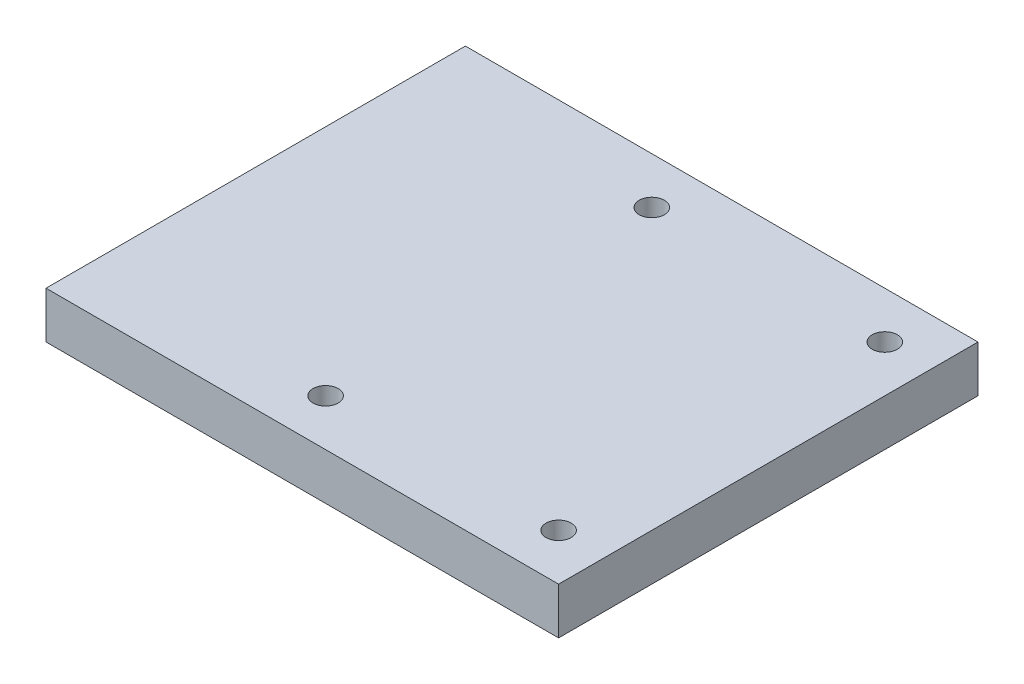
ISO-10303-21;
HEADER;
FILE_DESCRIPTION(('STEP AP214'),'2;1');
FILE_NAME('part.step','',(''),(''),'','','');
FILE_SCHEMA(('AUTOMOTIVE_DESIGN { 1 0 10303 214 1 1 1 1 }'));
ENDSEC;
DATA;
#1=APPLICATION_CONTEXT('core data for automotive mechanical design processes');
#2=APPLICATION_PROTOCOL_DEFINITION('international standard','automotive_design',2000,#1);
#3=PRODUCT_CONTEXT('',#1,'mechanical');
#4=PRODUCT('Part','Part','',(#3));
#5=PRODUCT_RELATED_PRODUCT_CATEGORY('part','',(#4));
#6=PRODUCT_DEFINITION_FORMATION('','',#4);
#7=PRODUCT_DEFINITION_CONTEXT('part definition',#1,'design');
#8=PRODUCT_DEFINITION('design','',#6,#7);
#9=PRODUCT_DEFINITION_SHAPE('','',#8);
#10=(LENGTH_UNIT() NAMED_UNIT(*) SI_UNIT(.MILLI.,.METRE.));
#11=(NAMED_UNIT(*) PLANE_ANGLE_UNIT() SI_UNIT($,.RADIAN.));
#12=(NAMED_UNIT(*) SI_UNIT($,.STERADIAN.) SOLID_ANGLE_UNIT());
#13=UNCERTAINTY_MEASURE_WITH_UNIT(LENGTH_MEASURE(1.E-05),#10,'distance_accuracy_value','');
#14=(GEOMETRIC_REPRESENTATION_CONTEXT(3) GLOBAL_UNCERTAINTY_ASSIGNED_CONTEXT((#13)) GLOBAL_UNIT_ASSIGNED_CONTEXT((#10,
#11,#12)) REPRESENTATION_CONTEXT('',''));
#15=CARTESIAN_POINT('',(0.,0.,0.));
#16=DIRECTION('',(0.,0.,1.));
#17=DIRECTION('',(1.,0.,0.));
#18=AXIS2_PLACEMENT_3D('',#15,#16,#17);
#19=CARTESIAN_POINT('',(69.85,12.7,-57.15));
#20=DIRECTION('',(-1.,0.,0.));
#21=DIRECTION('',(0.,0.,1.));
#22=AXIS2_PLACEMENT_3D('',#19,#20,#21);
#23=PLANE('',#22);
#24=DIRECTION('',(0.,0.,-1.));
#25=VECTOR('',#24,1.);
#26=CARTESIAN_POINT('',(69.85,0.,-57.15));
#27=LINE('',#26,#25);
#28=CARTESIAN_POINT('',(69.85,0.,57.15));
#29=VERTEX_POINT('',#28);
#30=CARTESIAN_POINT('',(69.85,0.,-57.15));
#31=VERTEX_POINT('',#30);
#32=EDGE_CURVE('E96',#29,#31,#27,.T.);
#33=ORIENTED_EDGE('',*,*,#32,.T.);
#34=DIRECTION('',(0.,-1.,0.));
#35=VECTOR('',#34,1.);
#36=CARTESIAN_POINT('',(69.85,12.7,-57.15));
#37=LINE('',#36,#35);
#38=CARTESIAN_POINT('',(69.85,12.7,-57.15));
#39=VERTEX_POINT('',#38);
#40=EDGE_CURVE('E11',#39,#31,#37,.T.);
#41=ORIENTED_EDGE('',*,*,#40,.F.);
#42=DIRECTION('',(0.,0.,-1.));
#43=VECTOR('',#42,1.);
#44=CARTESIAN_POINT('',(69.85,12.7,-57.15));
#45=LINE('',#44,#43);
#46=CARTESIAN_POINT('',(69.85,12.7,57.15));
#47=VERTEX_POINT('',#46);
#48=EDGE_CURVE('E84',#47,#39,#45,.T.);
#49=ORIENTED_EDGE('',*,*,#48,.F.);
#50=DIRECTION('',(0.,-1.,0.));
#51=VECTOR('',#50,1.);
#52=CARTESIAN_POINT('',(69.85,12.7,57.15));
#53=LINE('',#52,#51);
#54=EDGE_CURVE('E92',#47,#29,#53,.T.);
#55=ORIENTED_EDGE('',*,*,#54,.T.);
#56=EDGE_LOOP('',(#33,#41,#49,#55));
#57=FACE_BOUND('',#56,.T.);
#58=ADVANCED_FACE('F33',(#57),#23,.F.);
#59=CARTESIAN_POINT('',(-69.85,12.7,-57.15));
#60=DIRECTION('',(0.,0.,1.));
#61=DIRECTION('',(1.,0.,0.));
#62=AXIS2_PLACEMENT_3D('',#59,#60,#61);
#63=PLANE('',#62);
#64=DIRECTION('',(-1.,0.,0.));
#65=VECTOR('',#64,1.);
#66=CARTESIAN_POINT('',(-69.85,0.,-57.15));
#67=LINE('',#66,#65);
#68=CARTESIAN_POINT('',(-69.85,0.,-57.15));
#69=VERTEX_POINT('',#68);
#70=EDGE_CURVE('E88',#31,#69,#67,.T.);
#71=ORIENTED_EDGE('',*,*,#70,.T.);
#72=DIRECTION('',(0.,-1.,0.));
#73=VECTOR('',#72,1.);
#74=CARTESIAN_POINT('',(-69.85,12.7,-57.15));
#75=LINE('',#74,#73);
#76=CARTESIAN_POINT('',(-69.85,12.7,-57.15));
#77=VERTEX_POINT('',#76);
#78=EDGE_CURVE('E41',#77,#69,#75,.T.);
#79=ORIENTED_EDGE('',*,*,#78,.F.);
#80=DIRECTION('',(-1.,0.,0.));
#81=VECTOR('',#80,1.);
#82=CARTESIAN_POINT('',(-69.85,12.7,-57.15));
#83=LINE('',#82,#81);
#84=EDGE_CURVE('E79',#39,#77,#83,.T.);
#85=ORIENTED_EDGE('',*,*,#84,.F.);
#86=ORIENTED_EDGE('',*,*,#40,.T.);
#87=EDGE_LOOP('',(#71,#79,#85,#86));
#88=FACE_BOUND('',#87,.T.);
#89=ADVANCED_FACE('F87',(#88),#63,.F.);
#90=CARTESIAN_POINT('',(-69.85,12.7,-57.15));
#91=DIRECTION('',(1.,0.,0.));
#92=DIRECTION('',(0.,0.,-1.));
#93=AXIS2_PLACEMENT_3D('',#90,#91,#92);
#94=PLANE('',#93);
#95=DIRECTION('',(0.,0.,1.));
#96=VECTOR('',#95,1.);
#97=CARTESIAN_POINT('',(-69.85,0.,-57.15));
#98=LINE('',#97,#96);
#99=CARTESIAN_POINT('',(-69.85,0.,57.15));
#100=VERTEX_POINT('',#99);
#101=EDGE_CURVE('E66',#69,#100,#98,.T.);
#102=ORIENTED_EDGE('',*,*,#101,.T.);
#103=DIRECTION('',(0.,-1.,0.));
#104=VECTOR('',#103,1.);
#105=CARTESIAN_POINT('',(-69.85,12.7,57.15));
#106=LINE('',#105,#104);
#107=CARTESIAN_POINT('',(-69.85,12.7,57.15));
#108=VERTEX_POINT('',#107);
#109=EDGE_CURVE('E89',#108,#100,#106,.T.);
#110=ORIENTED_EDGE('',*,*,#109,.F.);
#111=DIRECTION('',(0.,0.,1.));
#112=VECTOR('',#111,1.);
#113=CARTESIAN_POINT('',(-69.85,12.7,-57.15));
#114=LINE('',#113,#112);
#115=EDGE_CURVE('E82',#77,#108,#114,.T.);
#116=ORIENTED_EDGE('',*,*,#115,.F.);
#117=ORIENTED_EDGE('',*,*,#78,.T.);
#118=EDGE_LOOP('',(#102,#110,#116,#117));
#119=FACE_BOUND('',#118,.T.);
#120=ADVANCED_FACE('F90',(#119),#94,.F.);
#121=CARTESIAN_POINT('',(-69.85,12.7,57.15));
#122=DIRECTION('',(0.,0.,-1.));
#123=DIRECTION('',(-1.,0.,0.));
#124=AXIS2_PLACEMENT_3D('',#121,#122,#123);
#125=PLANE('',#124);
#126=DIRECTION('',(1.,0.,0.));
#127=VECTOR('',#126,1.);
#128=CARTESIAN_POINT('',(-69.85,0.,57.15));
#129=LINE('',#128,#127);
#130=EDGE_CURVE('E72',#100,#29,#129,.T.);
#131=ORIENTED_EDGE('',*,*,#130,.T.);
#132=ORIENTED_EDGE('',*,*,#54,.F.);
#133=DIRECTION('',(1.,0.,0.));
#134=VECTOR('',#133,1.);
#135=CARTESIAN_POINT('',(-69.85,12.7,57.15));
#136=LINE('',#135,#134);
#137=EDGE_CURVE('E49',#108,#47,#136,.T.);
#138=ORIENTED_EDGE('',*,*,#137,.F.);
#139=ORIENTED_EDGE('',*,*,#109,.T.);
#140=EDGE_LOOP('',(#131,#132,#138,#139));
#141=FACE_BOUND('',#140,.T.);
#142=ADVANCED_FACE('F104',(#141),#125,.F.);
#143=CARTESIAN_POINT('',(0.,12.7,0.));
#144=DIRECTION('',(0.,1.,0.));
#145=DIRECTION('',(0.,0.,1.));
#146=AXIS2_PLACEMENT_3D('',#143,#144,#145);
#147=PLANE('',#146);
#148=CARTESIAN_POINT('',(57.15,12.7,-44.45));
#149=DIRECTION('',(0.,1.,0.));
#150=DIRECTION('',(0.,0.,1.));
#151=AXIS2_PLACEMENT_3D('',#148,#149,#150);
#152=CIRCLE('',#151,3.42899999999999);
#153=CARTESIAN_POINT('',(57.15,12.7,-41.021));
#154=VERTEX_POINT('',#153);
#155=EDGE_CURVE('E128',#154,#154,#152,.F.);
#156=ORIENTED_EDGE('',*,*,#155,.T.);
#157=EDGE_LOOP('',(#156));
#158=FACE_BOUND('',#157,.T.);
#159=CARTESIAN_POINT('',(57.15,12.7,44.45));
#160=DIRECTION('',(0.,1.,0.));
#161=DIRECTION('',(0.,0.,1.));
#162=AXIS2_PLACEMENT_3D('',#159,#160,#161);
#163=CIRCLE('',#162,3.42899999999999);
#164=CARTESIAN_POINT('',(57.15,12.7,47.879));
#165=VERTEX_POINT('',#164);
#166=EDGE_CURVE('E122',#165,#165,#163,.F.);
#167=ORIENTED_EDGE('',*,*,#166,.T.);
#168=EDGE_LOOP('',(#167));
#169=FACE_BOUND('',#168,.T.);
#170=CARTESIAN_POINT('',(-6.34999999999998,12.7,-44.45));
#171=DIRECTION('',(0.,1.,0.));
#172=DIRECTION('',(0.,0.,1.));
#173=AXIS2_PLACEMENT_3D('',#170,#171,#172);
#174=CIRCLE('',#173,3.429);
#175=CARTESIAN_POINT('',(-6.34999999999998,12.7,-41.021));
#176=VERTEX_POINT('',#175);
#177=EDGE_CURVE('E116',#176,#176,#174,.F.);
#178=ORIENTED_EDGE('',*,*,#177,.T.);
#179=EDGE_LOOP('',(#178));
#180=FACE_BOUND('',#179,.T.);
#181=CARTESIAN_POINT('',(-6.34999999999998,12.7,44.45));
#182=DIRECTION('',(0.,1.,0.));
#183=DIRECTION('',(0.,0.,1.));
#184=AXIS2_PLACEMENT_3D('',#181,#182,#183);
#185=CIRCLE('',#184,3.429);
#186=CARTESIAN_POINT('',(-6.34999999999998,12.7,47.879));
#187=VERTEX_POINT('',#186);
#188=EDGE_CURVE('E110',#187,#187,#185,.F.);
#189=ORIENTED_EDGE('',*,*,#188,.T.);
#190=EDGE_LOOP('',(#189));
#191=FACE_BOUND('',#190,.T.);
#192=ORIENTED_EDGE('',*,*,#48,.T.);
#193=ORIENTED_EDGE('',*,*,#84,.T.);
#194=ORIENTED_EDGE('',*,*,#115,.T.);
#195=ORIENTED_EDGE('',*,*,#137,.T.);
#196=EDGE_LOOP('',(#192,#193,#194,#195));
#197=FACE_BOUND('',#196,.T.);
#198=ADVANCED_FACE('F80',(#158,#169,#180,#191,#197),#147,.T.);
#199=CARTESIAN_POINT('',(0.,0.,0.));
#200=DIRECTION('',(0.,1.,0.));
#201=DIRECTION('',(0.,0.,1.));
#202=AXIS2_PLACEMENT_3D('',#199,#200,#201);
#203=PLANE('',#202);
#204=CARTESIAN_POINT('',(-53.975,0.,0.));
#205=DIRECTION('',(0.,-1.,0.));
#206=DIRECTION('',(0.,0.,-1.));
#207=AXIS2_PLACEMENT_3D('',#204,#205,#206);
#208=CIRCLE('',#207,12.7);
#209=CARTESIAN_POINT('',(-53.975,0.,-12.7));
#210=VERTEX_POINT('',#209);
#211=EDGE_CURVE('E134',#210,#210,#208,.T.);
#212=ORIENTED_EDGE('',*,*,#211,.F.);
#213=EDGE_LOOP('',(#212));
#214=FACE_BOUND('',#213,.T.);
#215=CARTESIAN_POINT('',(57.15,0.,-44.45));
#216=DIRECTION('',(0.,-1.,0.));
#217=DIRECTION('',(0.,0.,-1.));
#218=AXIS2_PLACEMENT_3D('',#215,#216,#217);
#219=CIRCLE('',#218,3.42899999999999);
#220=CARTESIAN_POINT('',(57.15,0.,-47.879));
#221=VERTEX_POINT('',#220);
#222=EDGE_CURVE('E125',#221,#221,#219,.T.);
#223=ORIENTED_EDGE('',*,*,#222,.F.);
#224=EDGE_LOOP('',(#223));
#225=FACE_BOUND('',#224,.T.);
#226=CARTESIAN_POINT('',(57.15,0.,44.45));
#227=DIRECTION('',(0.,-1.,0.));
#228=DIRECTION('',(0.,0.,1.));
#229=AXIS2_PLACEMENT_3D('',#226,#227,#228);
#230=CIRCLE('',#229,3.42899999999999);
#231=CARTESIAN_POINT('',(57.15,0.,47.879));
#232=VERTEX_POINT('',#231);
#233=EDGE_CURVE('E119',#232,#232,#230,.T.);
#234=ORIENTED_EDGE('',*,*,#233,.F.);
#235=EDGE_LOOP('',(#234));
#236=FACE_BOUND('',#235,.T.);
#237=CARTESIAN_POINT('',(-6.34999999999998,0.,-44.45));
#238=DIRECTION('',(0.,-1.,0.));
#239=DIRECTION('',(0.,0.,1.));
#240=AXIS2_PLACEMENT_3D('',#237,#238,#239);
#241=CIRCLE('',#240,3.429);
#242=CARTESIAN_POINT('',(-6.34999999999998,0.,-41.021));
#243=VERTEX_POINT('',#242);
#244=EDGE_CURVE('E113',#243,#243,#241,.T.);
#245=ORIENTED_EDGE('',*,*,#244,.F.);
#246=EDGE_LOOP('',(#245));
#247=FACE_BOUND('',#246,.T.);
#248=CARTESIAN_POINT('',(-6.34999999999998,0.,44.45));
#249=DIRECTION('',(0.,-1.,0.));
#250=DIRECTION('',(0.,0.,-1.));
#251=AXIS2_PLACEMENT_3D('',#248,#249,#250);
#252=CIRCLE('',#251,3.429);
#253=CARTESIAN_POINT('',(-6.34999999999998,0.,41.021));
#254=VERTEX_POINT('',#253);
#255=EDGE_CURVE('E99',#254,#254,#252,.T.);
#256=ORIENTED_EDGE('',*,*,#255,.F.);
#257=EDGE_LOOP('',(#256));
#258=FACE_BOUND('',#257,.T.);
#259=ORIENTED_EDGE('',*,*,#32,.F.);
#260=ORIENTED_EDGE('',*,*,#130,.F.);
#261=ORIENTED_EDGE('',*,*,#101,.F.);
#262=ORIENTED_EDGE('',*,*,#70,.F.);
#263=EDGE_LOOP('',(#259,#260,#261,#262));
#264=FACE_BOUND('',#263,.T.);
#265=ADVANCED_FACE('F107',(#214,#225,#236,#247,#258,#264),#203,.F.);
#266=CARTESIAN_POINT('',(-6.34999999999998,12.701,44.45));
#267=DIRECTION('',(0.,-1.,0.));
#268=DIRECTION('',(0.,0.,-1.));
#269=AXIS2_PLACEMENT_3D('',#266,#267,#268);
#270=CYLINDRICAL_SURFACE('',#269,3.429);
#271=ORIENTED_EDGE('',*,*,#188,.F.);
#272=EDGE_LOOP('',(#271));
#273=FACE_BOUND('',#272,.T.);
#274=ORIENTED_EDGE('',*,*,#255,.T.);
#275=EDGE_LOOP('',(#274));
#276=FACE_BOUND('',#275,.T.);
#277=ADVANCED_FACE('F151',(#273,#276),#270,.F.);
#278=CARTESIAN_POINT('',(-6.34999999999998,12.701,-44.45));
#279=DIRECTION('',(0.,-1.,0.));
#280=DIRECTION('',(0.,0.,-1.));
#281=AXIS2_PLACEMENT_3D('',#278,#279,#280);
#282=CYLINDRICAL_SURFACE('',#281,3.429);
#283=ORIENTED_EDGE('',*,*,#177,.F.);
#284=EDGE_LOOP('',(#283));
#285=FACE_BOUND('',#284,.T.);
#286=ORIENTED_EDGE('',*,*,#244,.T.);
#287=EDGE_LOOP('',(#286));
#288=FACE_BOUND('',#287,.T.);
#289=ADVANCED_FACE('F162',(#285,#288),#282,.F.);
#290=CARTESIAN_POINT('',(57.15,12.701,44.45));
#291=DIRECTION('',(0.,-1.,0.));
#292=DIRECTION('',(0.,0.,-1.));
#293=AXIS2_PLACEMENT_3D('',#290,#291,#292);
#294=CYLINDRICAL_SURFACE('',#293,3.42899999999999);
#295=ORIENTED_EDGE('',*,*,#166,.F.);
#296=EDGE_LOOP('',(#295));
#297=FACE_BOUND('',#296,.T.);
#298=ORIENTED_EDGE('',*,*,#233,.T.);
#299=EDGE_LOOP('',(#298));
#300=FACE_BOUND('',#299,.T.);
#301=ADVANCED_FACE('F168',(#297,#300),#294,.F.);
#302=CARTESIAN_POINT('',(57.15,12.701,-44.45));
#303=DIRECTION('',(0.,-1.,0.));
#304=DIRECTION('',(0.,0.,-1.));
#305=AXIS2_PLACEMENT_3D('',#302,#303,#304);
#306=CYLINDRICAL_SURFACE('',#305,3.42899999999999);
#307=ORIENTED_EDGE('',*,*,#155,.F.);
#308=EDGE_LOOP('',(#307));
#309=FACE_BOUND('',#308,.T.);
#310=ORIENTED_EDGE('',*,*,#222,.T.);
#311=EDGE_LOOP('',(#310));
#312=FACE_BOUND('',#311,.T.);
#313=ADVANCED_FACE('F145',(#309,#312),#306,.F.);
#314=CARTESIAN_POINT('',(-53.975,7.874,0.));
#315=DIRECTION('',(0.,-1.,0.));
#316=DIRECTION('',(0.,0.,-1.));
#317=AXIS2_PLACEMENT_3D('',#314,#315,#316);
#318=CYLINDRICAL_SURFACE('',#317,12.7);
#319=CARTESIAN_POINT('',(-53.975,7.874,0.));
#320=DIRECTION('',(0.,-1.,0.));
#321=DIRECTION('',(0.,0.,-1.));
#322=AXIS2_PLACEMENT_3D('',#319,#320,#321);
#323=CIRCLE('',#322,12.7);
#324=CARTESIAN_POINT('',(-53.975,7.874,-12.7));
#325=VERTEX_POINT('',#324);
#326=EDGE_CURVE('E131',#325,#325,#323,.T.);
#327=ORIENTED_EDGE('',*,*,#326,.F.);
#328=EDGE_LOOP('',(#327));
#329=FACE_BOUND('',#328,.T.);
#330=ORIENTED_EDGE('',*,*,#211,.T.);
#331=EDGE_LOOP('',(#330));
#332=FACE_BOUND('',#331,.T.);
#333=ADVANCED_FACE('F142',(#329,#332),#318,.F.);
#334=CARTESIAN_POINT('',(-53.975,7.874,0.));
#335=DIRECTION('',(0.,-1.,0.));
#336=DIRECTION('',(0.,0.,-1.));
#337=AXIS2_PLACEMENT_3D('',#334,#335,#336);
#338=PLANE('',#337);
#339=ORIENTED_EDGE('',*,*,#326,.T.);
#340=EDGE_LOOP('',(#339));
#341=FACE_BOUND('',#340,.T.);
#342=ADVANCED_FACE('F140',(#341),#338,.T.);
#343=CLOSED_SHELL('',(#58,#89,#120,#142,#198,#265,#277,#289,#301,#313,#333,#342));
#344=MANIFOLD_SOLID_BREP('B2',#343);
#345=ADVANCED_BREP_SHAPE_REPRESENTATION('',(#18,#344),#14);
#346=SHAPE_DEFINITION_REPRESENTATION(#9,#345);
ENDSEC;
END-ISO-10303-21;
